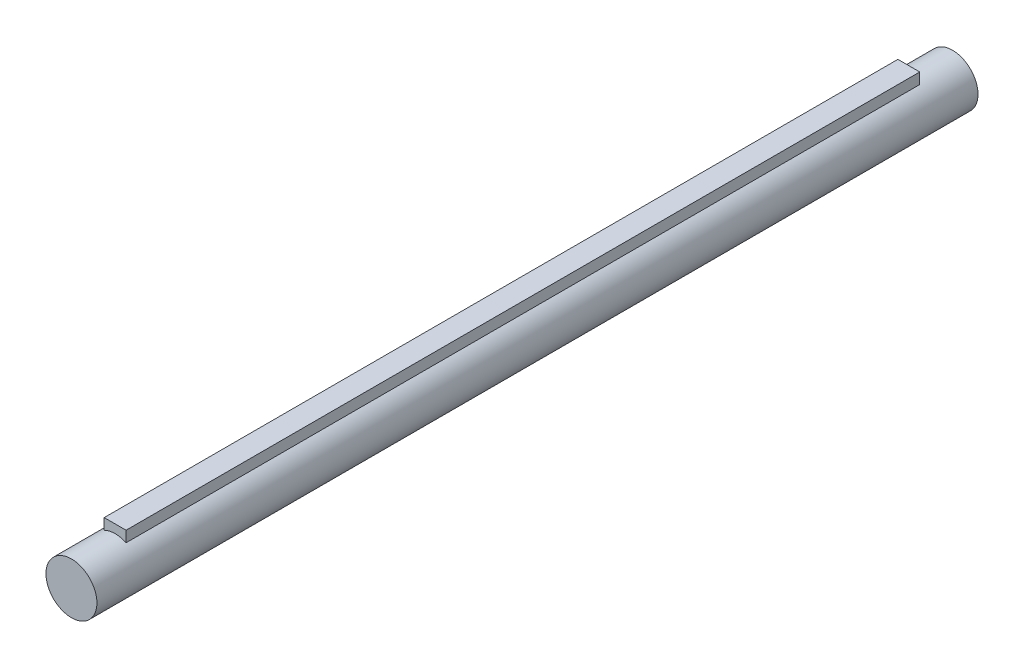
ISO-10303-21;
HEADER;
FILE_DESCRIPTION(('STEP AP214'),'2;1');
FILE_NAME('part.step','',(''),(''),'','','');
FILE_SCHEMA(('AUTOMOTIVE_DESIGN { 1 0 10303 214 1 1 1 1 }'));
ENDSEC;
DATA;
#1=APPLICATION_CONTEXT('core data for automotive mechanical design processes');
#2=APPLICATION_PROTOCOL_DEFINITION('international standard','automotive_design',2000,#1);
#3=PRODUCT_CONTEXT('',#1,'mechanical');
#4=PRODUCT('Part','Part','',(#3));
#5=PRODUCT_RELATED_PRODUCT_CATEGORY('part','',(#4));
#6=PRODUCT_DEFINITION_FORMATION('','',#4);
#7=PRODUCT_DEFINITION_CONTEXT('part definition',#1,'design');
#8=PRODUCT_DEFINITION('design','',#6,#7);
#9=PRODUCT_DEFINITION_SHAPE('','',#8);
#10=(LENGTH_UNIT() NAMED_UNIT(*) SI_UNIT(.MILLI.,.METRE.));
#11=(NAMED_UNIT(*) PLANE_ANGLE_UNIT() SI_UNIT($,.RADIAN.));
#12=(NAMED_UNIT(*) SI_UNIT($,.STERADIAN.) SOLID_ANGLE_UNIT());
#13=UNCERTAINTY_MEASURE_WITH_UNIT(LENGTH_MEASURE(1.E-05),#10,'distance_accuracy_value','');
#14=(GEOMETRIC_REPRESENTATION_CONTEXT(3) GLOBAL_UNCERTAINTY_ASSIGNED_CONTEXT((#13)) GLOBAL_UNIT_ASSIGNED_CONTEXT((#10,
#11,#12)) REPRESENTATION_CONTEXT('',''));
#15=CARTESIAN_POINT('',(0.,0.,0.));
#16=DIRECTION('',(0.,0.,1.));
#17=DIRECTION('',(1.,0.,0.));
#18=AXIS2_PLACEMENT_3D('',#15,#16,#17);
#19=CARTESIAN_POINT('',(1.5,4.66227766016838,121.));
#20=DIRECTION('',(-1.,0.,0.));
#21=DIRECTION('',(0.,0.,1.));
#22=AXIS2_PLACEMENT_3D('',#19,#20,#21);
#23=PLANE('',#22);
#24=DIRECTION('',(0.,-1.,0.));
#25=VECTOR('',#24,1.);
#26=CARTESIAN_POINT('',(1.5,4.66227766016838,6.));
#27=LINE('',#26,#25);
#28=CARTESIAN_POINT('',(1.5,4.66227766016838,6.));
#29=VERTEX_POINT('',#28);
#30=CARTESIAN_POINT('',(1.5,3.16227766016838,6.));
#31=VERTEX_POINT('',#30);
#32=EDGE_CURVE('E76',#29,#31,#27,.T.);
#33=ORIENTED_EDGE('',*,*,#32,.F.);
#34=DIRECTION('',(0.,0.,-1.));
#35=VECTOR('',#34,1.);
#36=CARTESIAN_POINT('',(1.5,4.66227766016838,121.));
#37=LINE('',#36,#35);
#38=CARTESIAN_POINT('',(1.5,4.66227766016838,115.));
#39=VERTEX_POINT('',#38);
#40=EDGE_CURVE('E41',#39,#29,#37,.T.);
#41=ORIENTED_EDGE('',*,*,#40,.F.);
#42=DIRECTION('',(0.,1.,0.));
#43=VECTOR('',#42,1.);
#44=CARTESIAN_POINT('',(1.5,0.,115.));
#45=LINE('',#44,#43);
#46=CARTESIAN_POINT('',(1.5,3.16227766016838,115.));
#47=VERTEX_POINT('',#46);
#48=EDGE_CURVE('E53',#47,#39,#45,.T.);
#49=ORIENTED_EDGE('',*,*,#48,.F.);
#50=DIRECTION('',(0.,0.,-1.));
#51=VECTOR('',#50,1.);
#52=CARTESIAN_POINT('',(1.5,3.16227766016838,121.));
#53=LINE('',#52,#51);
#54=EDGE_CURVE('E11',#47,#31,#53,.T.);
#55=ORIENTED_EDGE('',*,*,#54,.T.);
#56=EDGE_LOOP('',(#33,#41,#49,#55));
#57=FACE_BOUND('',#56,.T.);
#58=ADVANCED_FACE('F33',(#57),#23,.F.);
#59=CARTESIAN_POINT('',(-1.5,4.66227766016838,121.));
#60=DIRECTION('',(0.,-1.,0.));
#61=DIRECTION('',(0.,0.,-1.));
#62=AXIS2_PLACEMENT_3D('',#59,#60,#61);
#63=PLANE('',#62);
#64=DIRECTION('',(1.,0.,0.));
#65=VECTOR('',#64,1.);
#66=CARTESIAN_POINT('',(-1.5,4.66227766016838,6.));
#67=LINE('',#66,#65);
#68=CARTESIAN_POINT('',(-1.5,4.66227766016838,6.));
#69=VERTEX_POINT('',#68);
#70=EDGE_CURVE('E73',#69,#29,#67,.T.);
#71=ORIENTED_EDGE('',*,*,#70,.F.);
#72=DIRECTION('',(0.,0.,-1.));
#73=VECTOR('',#72,1.);
#74=CARTESIAN_POINT('',(-1.5,4.66227766016838,121.));
#75=LINE('',#74,#73);
#76=CARTESIAN_POINT('',(-1.5,4.66227766016838,115.));
#77=VERTEX_POINT('',#76);
#78=EDGE_CURVE('E90',#77,#69,#75,.T.);
#79=ORIENTED_EDGE('',*,*,#78,.F.);
#80=DIRECTION('',(-1.,0.,0.));
#81=VECTOR('',#80,1.);
#82=CARTESIAN_POINT('',(0.,4.66227766016838,115.));
#83=LINE('',#82,#81);
#84=EDGE_CURVE('E48',#39,#77,#83,.T.);
#85=ORIENTED_EDGE('',*,*,#84,.F.);
#86=ORIENTED_EDGE('',*,*,#40,.T.);
#87=EDGE_LOOP('',(#71,#79,#85,#86));
#88=FACE_BOUND('',#87,.T.);
#89=ADVANCED_FACE('F89',(#88),#63,.F.);
#90=CARTESIAN_POINT('',(-1.5,3.16227766016838,121.));
#91=DIRECTION('',(1.,0.,0.));
#92=DIRECTION('',(0.,0.,-1.));
#93=AXIS2_PLACEMENT_3D('',#90,#91,#92);
#94=PLANE('',#93);
#95=DIRECTION('',(0.,1.,0.));
#96=VECTOR('',#95,1.);
#97=CARTESIAN_POINT('',(-1.5,3.16227766016838,6.));
#98=LINE('',#97,#96);
#99=CARTESIAN_POINT('',(-1.5,3.16227766016838,6.));
#100=VERTEX_POINT('',#99);
#101=EDGE_CURVE('E78',#100,#69,#98,.T.);
#102=ORIENTED_EDGE('',*,*,#101,.F.);
#103=DIRECTION('',(0.,0.,-1.));
#104=VECTOR('',#103,1.);
#105=CARTESIAN_POINT('',(-1.5,3.16227766016838,121.));
#106=LINE('',#105,#104);
#107=CARTESIAN_POINT('',(-1.5,3.16227766016838,115.));
#108=VERTEX_POINT('',#107);
#109=EDGE_CURVE('E91',#108,#100,#106,.T.);
#110=ORIENTED_EDGE('',*,*,#109,.F.);
#111=DIRECTION('',(0.,-1.,0.));
#112=VECTOR('',#111,1.);
#113=CARTESIAN_POINT('',(-1.5,0.,115.));
#114=LINE('',#113,#112);
#115=EDGE_CURVE('E106',#77,#108,#114,.T.);
#116=ORIENTED_EDGE('',*,*,#115,.F.);
#117=ORIENTED_EDGE('',*,*,#78,.T.);
#118=EDGE_LOOP('',(#102,#110,#116,#117));
#119=FACE_BOUND('',#118,.T.);
#120=ADVANCED_FACE('F112',(#119),#94,.F.);
#121=CARTESIAN_POINT('',(0.,0.,121.));
#122=DIRECTION('',(0.,0.,1.));
#123=DIRECTION('',(1.,0.,0.));
#124=AXIS2_PLACEMENT_3D('',#121,#122,#123);
#125=PLANE('',#124);
#126=CARTESIAN_POINT('',(0.,0.,121.));
#127=DIRECTION('',(0.,0.,1.));
#128=DIRECTION('',(1.,0.,0.));
#129=AXIS2_PLACEMENT_3D('',#126,#127,#128);
#130=CIRCLE('',#129,3.5);
#131=CARTESIAN_POINT('',(3.5,0.,121.));
#132=VERTEX_POINT('',#131);
#133=EDGE_CURVE('E96',#132,#132,#130,.T.);
#134=ORIENTED_EDGE('',*,*,#133,.T.);
#135=EDGE_LOOP('',(#134));
#136=FACE_BOUND('',#135,.T.);
#137=ADVANCED_FACE('F133',(#136),#125,.T.);
#138=CARTESIAN_POINT('',(0.,0.,121.));
#139=DIRECTION('',(0.,0.,-1.));
#140=DIRECTION('',(-1.,0.,0.));
#141=AXIS2_PLACEMENT_3D('',#138,#139,#140);
#142=CYLINDRICAL_SURFACE('',#141,3.5);
#143=CARTESIAN_POINT('',(0.,0.,0.));
#144=DIRECTION('',(0.,0.,1.));
#145=DIRECTION('',(1.,0.,0.));
#146=AXIS2_PLACEMENT_3D('',#143,#144,#145);
#147=CIRCLE('',#146,3.5);
#148=CARTESIAN_POINT('',(3.5,0.,0.));
#149=VERTEX_POINT('',#148);
#150=EDGE_CURVE('E97',#149,#149,#147,.T.);
#151=ORIENTED_EDGE('',*,*,#150,.T.);
#152=EDGE_LOOP('',(#151));
#153=FACE_BOUND('',#152,.T.);
#154=ORIENTED_EDGE('',*,*,#54,.F.);
#155=CARTESIAN_POINT('',(0.,0.,115.));
#156=DIRECTION('',(0.,0.,1.));
#157=DIRECTION('',(1.,0.,0.));
#158=AXIS2_PLACEMENT_3D('',#155,#156,#157);
#159=CIRCLE('',#158,3.5);
#160=EDGE_CURVE('E104',#108,#47,#159,.F.);
#161=ORIENTED_EDGE('',*,*,#160,.F.);
#162=ORIENTED_EDGE('',*,*,#109,.T.);
#163=CARTESIAN_POINT('',(0.,0.,6.));
#164=DIRECTION('',(0.,0.,1.));
#165=DIRECTION('',(-1.,0.,0.));
#166=AXIS2_PLACEMENT_3D('',#163,#164,#165);
#167=CIRCLE('',#166,3.5);
#168=EDGE_CURVE('E87',#31,#100,#167,.T.);
#169=ORIENTED_EDGE('',*,*,#168,.F.);
#170=EDGE_LOOP('',(#154,#161,#162,#169));
#171=FACE_BOUND('',#170,.T.);
#172=ORIENTED_EDGE('',*,*,#133,.F.);
#173=EDGE_LOOP('',(#172));
#174=FACE_BOUND('',#173,.T.);
#175=ADVANCED_FACE('F35',(#153,#171,#174),#142,.T.);
#176=CARTESIAN_POINT('',(0.,0.,0.));
#177=DIRECTION('',(0.,0.,1.));
#178=DIRECTION('',(1.,0.,0.));
#179=AXIS2_PLACEMENT_3D('',#176,#177,#178);
#180=PLANE('',#179);
#181=ORIENTED_EDGE('',*,*,#150,.F.);
#182=EDGE_LOOP('',(#181));
#183=FACE_BOUND('',#182,.T.);
#184=ADVANCED_FACE('F116',(#183),#180,.F.);
#185=CARTESIAN_POINT('',(0.,0.,115.));
#186=DIRECTION('',(0.,0.,1.));
#187=DIRECTION('',(1.,0.,0.));
#188=AXIS2_PLACEMENT_3D('',#185,#186,#187);
#189=PLANE('',#188);
#190=ORIENTED_EDGE('',*,*,#115,.T.);
#191=ORIENTED_EDGE('',*,*,#160,.T.);
#192=ORIENTED_EDGE('',*,*,#48,.T.);
#193=ORIENTED_EDGE('',*,*,#84,.T.);
#194=EDGE_LOOP('',(#190,#191,#192,#193));
#195=FACE_BOUND('',#194,.T.);
#196=ADVANCED_FACE('F114',(#195),#189,.T.);
#197=CARTESIAN_POINT('',(0.,0.,6.));
#198=DIRECTION('',(0.,0.,-1.));
#199=DIRECTION('',(-1.,0.,0.));
#200=AXIS2_PLACEMENT_3D('',#197,#198,#199);
#201=PLANE('',#200);
#202=ORIENTED_EDGE('',*,*,#70,.T.);
#203=ORIENTED_EDGE('',*,*,#32,.T.);
#204=ORIENTED_EDGE('',*,*,#168,.T.);
#205=ORIENTED_EDGE('',*,*,#101,.T.);
#206=EDGE_LOOP('',(#202,#203,#204,#205));
#207=FACE_BOUND('',#206,.T.);
#208=ADVANCED_FACE('F75',(#207),#201,.T.);
#209=CLOSED_SHELL('',(#58,#89,#120,#137,#175,#184,#196,#208));
#210=MANIFOLD_SOLID_BREP('B2',#209);
#211=ADVANCED_BREP_SHAPE_REPRESENTATION('',(#18,#210),#14);
#212=SHAPE_DEFINITION_REPRESENTATION(#9,#211);
ENDSEC;
END-ISO-10303-21;
